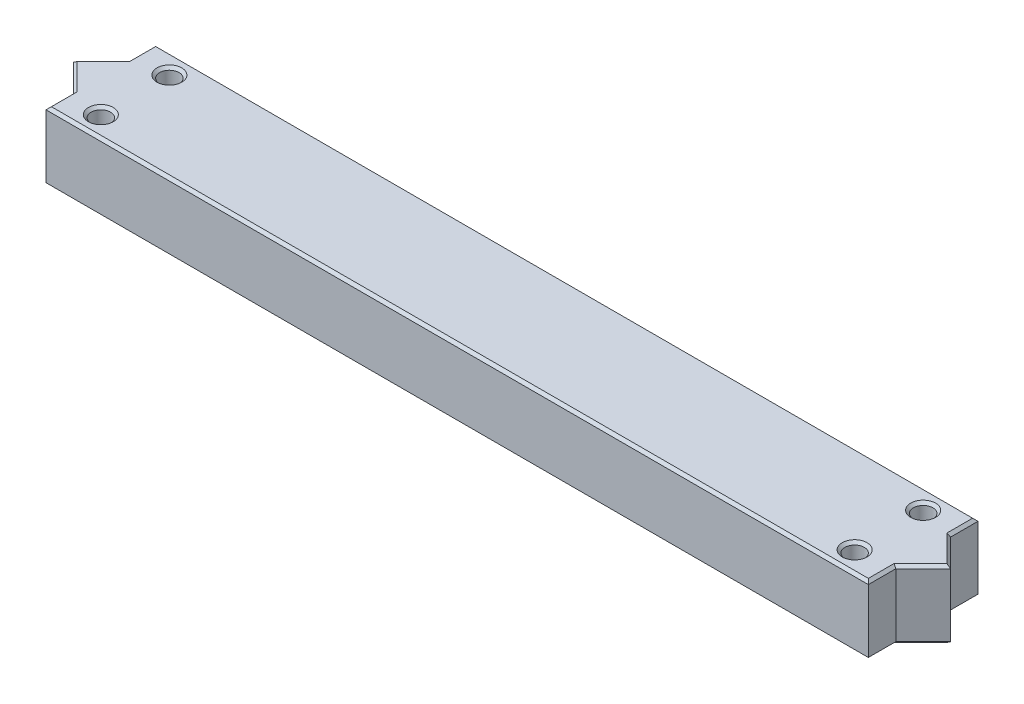
ISO-10303-21;
HEADER;
FILE_DESCRIPTION(('STEP AP214'),'2;1');
FILE_NAME('part.step','',(''),(''),'','','');
FILE_SCHEMA(('AUTOMOTIVE_DESIGN { 1 0 10303 214 1 1 1 1 }'));
ENDSEC;
DATA;
#1=APPLICATION_CONTEXT('core data for automotive mechanical design processes');
#2=APPLICATION_PROTOCOL_DEFINITION('international standard','automotive_design',2000,#1);
#3=PRODUCT_CONTEXT('',#1,'mechanical');
#4=PRODUCT('Part','Part','',(#3));
#5=PRODUCT_RELATED_PRODUCT_CATEGORY('part','',(#4));
#6=PRODUCT_DEFINITION_FORMATION('','',#4);
#7=PRODUCT_DEFINITION_CONTEXT('part definition',#1,'design');
#8=PRODUCT_DEFINITION('design','',#6,#7);
#9=PRODUCT_DEFINITION_SHAPE('','',#8);
#10=(LENGTH_UNIT() NAMED_UNIT(*) SI_UNIT(.MILLI.,.METRE.));
#11=(NAMED_UNIT(*) PLANE_ANGLE_UNIT() SI_UNIT($,.RADIAN.));
#12=(NAMED_UNIT(*) SI_UNIT($,.STERADIAN.) SOLID_ANGLE_UNIT());
#13=UNCERTAINTY_MEASURE_WITH_UNIT(LENGTH_MEASURE(1.E-05),#10,'distance_accuracy_value','');
#14=(GEOMETRIC_REPRESENTATION_CONTEXT(3) GLOBAL_UNCERTAINTY_ASSIGNED_CONTEXT((#13)) GLOBAL_UNIT_ASSIGNED_CONTEXT((#10,
#11,#12)) REPRESENTATION_CONTEXT('',''));
#15=CARTESIAN_POINT('',(0.,0.,0.));
#16=DIRECTION('',(0.,0.,1.));
#17=DIRECTION('',(1.,0.,0.));
#18=AXIS2_PLACEMENT_3D('',#15,#16,#17);
#19=CARTESIAN_POINT('',(0.,12.7,0.));
#20=DIRECTION('',(0.,1.,0.));
#21=DIRECTION('',(0.,0.,1.));
#22=AXIS2_PLACEMENT_3D('',#19,#20,#21);
#23=PLANE('',#22);
#24=CARTESIAN_POINT('',(69.85,12.7,-6.35));
#25=DIRECTION('',(0.,1.,0.));
#26=DIRECTION('',(0.,0.,1.));
#27=AXIS2_PLACEMENT_3D('',#24,#25,#26);
#28=CIRCLE('',#27,2.30000000000001);
#29=CARTESIAN_POINT('',(69.85,12.7,-4.04999999999999));
#30=VERTEX_POINT('',#29);
#31=EDGE_CURVE('E11',#30,#30,#28,.F.);
#32=ORIENTED_EDGE('',*,*,#31,.T.);
#33=EDGE_LOOP('',(#32));
#34=FACE_BOUND('',#33,.T.);
#35=CARTESIAN_POINT('',(-69.85,12.7,6.35));
#36=DIRECTION('',(0.,1.,0.));
#37=DIRECTION('',(0.,0.,1.));
#38=AXIS2_PLACEMENT_3D('',#35,#36,#37);
#39=CIRCLE('',#38,2.30000000000001);
#40=CARTESIAN_POINT('',(-69.85,12.7,8.65000000000001));
#41=VERTEX_POINT('',#40);
#42=EDGE_CURVE('E47',#41,#41,#39,.F.);
#43=ORIENTED_EDGE('',*,*,#42,.T.);
#44=EDGE_LOOP('',(#43));
#45=FACE_BOUND('',#44,.T.);
#46=DIRECTION('',(0.,0.,1.));
#47=VECTOR('',#46,1.);
#48=CARTESIAN_POINT('',(-75.7,12.7,10.16));
#49=LINE('',#48,#47);
#50=CARTESIAN_POINT('',(-75.7,12.7,4.87289321881346));
#51=VERTEX_POINT('',#50);
#52=CARTESIAN_POINT('',(-75.7,12.7,9.66000000000002));
#53=VERTEX_POINT('',#52);
#54=EDGE_CURVE('E55',#51,#53,#49,.T.);
#55=ORIENTED_EDGE('',*,*,#54,.T.);
#56=DIRECTION('',(1.,0.,0.));
#57=VECTOR('',#56,1.);
#58=CARTESIAN_POINT('',(76.2,12.7,9.66000000000002));
#59=LINE('',#58,#57);
#60=CARTESIAN_POINT('',(75.7,12.7,9.66000000000002));
#61=VERTEX_POINT('',#60);
#62=EDGE_CURVE('E307',#53,#61,#59,.T.);
#63=ORIENTED_EDGE('',*,*,#62,.T.);
#64=DIRECTION('',(0.,0.,-1.));
#65=VECTOR('',#64,1.);
#66=CARTESIAN_POINT('',(75.7,12.7,5.08));
#67=LINE('',#66,#65);
#68=CARTESIAN_POINT('',(75.7,12.7,4.87289321881347));
#69=VERTEX_POINT('',#68);
#70=EDGE_CURVE('E291',#61,#69,#67,.T.);
#71=ORIENTED_EDGE('',*,*,#70,.T.);
#72=DIRECTION('',(0.707106781186548,0.,-0.707106781186547));
#73=VECTOR('',#72,1.);
#74=CARTESIAN_POINT('',(80.9264466094068,12.7,-0.353553390593263));
#75=LINE('',#74,#73);
#76=CARTESIAN_POINT('',(80.5728932188135,12.7,0.));
#77=VERTEX_POINT('',#76);
#78=EDGE_CURVE('E293',#69,#77,#75,.T.);
#79=ORIENTED_EDGE('',*,*,#78,.T.);
#80=DIRECTION('',(-0.707106781186548,0.,-0.707106781186547));
#81=VECTOR('',#80,1.);
#82=CARTESIAN_POINT('',(75.8464466094067,12.7,-4.72644660940674));
#83=LINE('',#82,#81);
#84=CARTESIAN_POINT('',(75.7,12.7,-4.87289321881346));
#85=VERTEX_POINT('',#84);
#86=EDGE_CURVE('E295',#77,#85,#83,.T.);
#87=ORIENTED_EDGE('',*,*,#86,.T.);
#88=DIRECTION('',(0.,0.,-1.));
#89=VECTOR('',#88,1.);
#90=CARTESIAN_POINT('',(75.7,12.7,-10.16));
#91=LINE('',#90,#89);
#92=CARTESIAN_POINT('',(75.7,12.7,-9.66000000000001));
#93=VERTEX_POINT('',#92);
#94=EDGE_CURVE('E297',#85,#93,#91,.T.);
#95=ORIENTED_EDGE('',*,*,#94,.T.);
#96=DIRECTION('',(-1.,0.,0.));
#97=VECTOR('',#96,1.);
#98=CARTESIAN_POINT('',(-76.2,12.7,-9.66000000000001));
#99=LINE('',#98,#97);
#100=CARTESIAN_POINT('',(-75.7,12.7,-9.66000000000001));
#101=VERTEX_POINT('',#100);
#102=EDGE_CURVE('E299',#93,#101,#99,.T.);
#103=ORIENTED_EDGE('',*,*,#102,.T.);
#104=DIRECTION('',(0.,0.,1.));
#105=VECTOR('',#104,1.);
#106=CARTESIAN_POINT('',(-75.7,12.7,-5.08));
#107=LINE('',#106,#105);
#108=CARTESIAN_POINT('',(-75.7,12.7,-4.87289321881347));
#109=VERTEX_POINT('',#108);
#110=EDGE_CURVE('E301',#101,#109,#107,.T.);
#111=ORIENTED_EDGE('',*,*,#110,.T.);
#112=DIRECTION('',(-0.707106781186548,0.,0.707106781186547));
#113=VECTOR('',#112,1.);
#114=CARTESIAN_POINT('',(-80.9264466094068,12.7,0.353553390593263));
#115=LINE('',#114,#113);
#116=CARTESIAN_POINT('',(-80.5728932188135,12.7,0.));
#117=VERTEX_POINT('',#116);
#118=EDGE_CURVE('E303',#109,#117,#115,.T.);
#119=ORIENTED_EDGE('',*,*,#118,.T.);
#120=DIRECTION('',(0.707106781186548,0.,0.707106781186547));
#121=VECTOR('',#120,1.);
#122=CARTESIAN_POINT('',(-75.8464466094067,12.7,4.72644660940674));
#123=LINE('',#122,#121);
#124=EDGE_CURVE('E60',#117,#51,#123,.T.);
#125=ORIENTED_EDGE('',*,*,#124,.T.);
#126=EDGE_LOOP('',(#55,#63,#71,#79,#87,#95,#103,#111,#119,#125));
#127=FACE_BOUND('',#126,.T.);
#128=CARTESIAN_POINT('',(-69.85,12.7,-6.35));
#129=DIRECTION('',(0.,1.,0.));
#130=DIRECTION('',(0.,0.,1.));
#131=AXIS2_PLACEMENT_3D('',#128,#129,#130);
#132=CIRCLE('',#131,2.30000000000001);
#133=CARTESIAN_POINT('',(-69.85,12.7,-4.04999999999999));
#134=VERTEX_POINT('',#133);
#135=EDGE_CURVE('E288',#134,#134,#132,.F.);
#136=ORIENTED_EDGE('',*,*,#135,.T.);
#137=EDGE_LOOP('',(#136));
#138=FACE_BOUND('',#137,.T.);
#139=CARTESIAN_POINT('',(69.85,12.7,6.35));
#140=DIRECTION('',(0.,1.,0.));
#141=DIRECTION('',(0.,0.,1.));
#142=AXIS2_PLACEMENT_3D('',#139,#140,#141);
#143=CIRCLE('',#142,2.30000000000001);
#144=CARTESIAN_POINT('',(69.85,12.7,8.65000000000001));
#145=VERTEX_POINT('',#144);
#146=EDGE_CURVE('E285',#145,#145,#143,.F.);
#147=ORIENTED_EDGE('',*,*,#146,.T.);
#148=EDGE_LOOP('',(#147));
#149=FACE_BOUND('',#148,.T.);
#150=ADVANCED_FACE('F37',(#34,#45,#127,#138,#149),#23,.T.);
#151=CARTESIAN_POINT('',(0.,0.,0.));
#152=DIRECTION('',(0.,1.,0.));
#153=DIRECTION('',(0.,0.,1.));
#154=AXIS2_PLACEMENT_3D('',#151,#152,#153);
#155=PLANE('',#154);
#156=CARTESIAN_POINT('',(69.85,0.,-6.35));
#157=DIRECTION('',(0.,1.,0.));
#158=DIRECTION('',(0.,0.,1.));
#159=AXIS2_PLACEMENT_3D('',#156,#157,#158);
#160=CIRCLE('',#159,2.30000000000001);
#161=CARTESIAN_POINT('',(69.85,0.,-4.04999999999999));
#162=VERTEX_POINT('',#161);
#163=EDGE_CURVE('E218',#162,#162,#160,.T.);
#164=ORIENTED_EDGE('',*,*,#163,.T.);
#165=EDGE_LOOP('',(#164));
#166=FACE_BOUND('',#165,.T.);
#167=CARTESIAN_POINT('',(69.85,0.,6.35));
#168=DIRECTION('',(0.,1.,0.));
#169=DIRECTION('',(0.,0.,1.));
#170=AXIS2_PLACEMENT_3D('',#167,#168,#169);
#171=CIRCLE('',#170,2.30000000000001);
#172=CARTESIAN_POINT('',(69.85,0.,8.65000000000001));
#173=VERTEX_POINT('',#172);
#174=EDGE_CURVE('E215',#173,#173,#171,.T.);
#175=ORIENTED_EDGE('',*,*,#174,.T.);
#176=EDGE_LOOP('',(#175));
#177=FACE_BOUND('',#176,.T.);
#178=CARTESIAN_POINT('',(-69.85,0.,6.35));
#179=DIRECTION('',(0.,1.,0.));
#180=DIRECTION('',(0.,0.,1.));
#181=AXIS2_PLACEMENT_3D('',#178,#179,#180);
#182=CIRCLE('',#181,2.30000000000001);
#183=CARTESIAN_POINT('',(-69.85,0.,8.65000000000001));
#184=VERTEX_POINT('',#183);
#185=EDGE_CURVE('E207',#184,#184,#182,.T.);
#186=ORIENTED_EDGE('',*,*,#185,.T.);
#187=EDGE_LOOP('',(#186));
#188=FACE_BOUND('',#187,.T.);
#189=CARTESIAN_POINT('',(-69.85,0.,-6.35));
#190=DIRECTION('',(0.,1.,0.));
#191=DIRECTION('',(0.,0.,1.));
#192=AXIS2_PLACEMENT_3D('',#189,#190,#191);
#193=CIRCLE('',#192,2.30000000000001);
#194=CARTESIAN_POINT('',(-69.85,0.,-4.04999999999999));
#195=VERTEX_POINT('',#194);
#196=EDGE_CURVE('E204',#195,#195,#193,.T.);
#197=ORIENTED_EDGE('',*,*,#196,.T.);
#198=EDGE_LOOP('',(#197));
#199=FACE_BOUND('',#198,.T.);
#200=DIRECTION('',(0.707106781186548,0.,0.707106781186547));
#201=VECTOR('',#200,1.);
#202=CARTESIAN_POINT('',(40.2864466094067,0.,-40.2864466094067));
#203=LINE('',#202,#201);
#204=CARTESIAN_POINT('',(75.7,0.,-4.87289321881346));
#205=VERTEX_POINT('',#204);
#206=CARTESIAN_POINT('',(80.5728932188135,0.,0.));
#207=VERTEX_POINT('',#206);
#208=EDGE_CURVE('E203',#205,#207,#203,.T.);
#209=ORIENTED_EDGE('',*,*,#208,.T.);
#210=DIRECTION('',(-0.707106781186548,0.,0.707106781186547));
#211=VECTOR('',#210,1.);
#212=CARTESIAN_POINT('',(40.2864466094067,0.,40.2864466094067));
#213=LINE('',#212,#211);
#214=CARTESIAN_POINT('',(75.7,0.,4.87289321881346));
#215=VERTEX_POINT('',#214);
#216=EDGE_CURVE('E182',#207,#215,#213,.T.);
#217=ORIENTED_EDGE('',*,*,#216,.T.);
#218=DIRECTION('',(0.,0.,1.));
#219=VECTOR('',#218,1.);
#220=CARTESIAN_POINT('',(75.7,0.,0.));
#221=LINE('',#220,#219);
#222=CARTESIAN_POINT('',(75.7,0.,9.66000000000002));
#223=VERTEX_POINT('',#222);
#224=EDGE_CURVE('E192',#215,#223,#221,.T.);
#225=ORIENTED_EDGE('',*,*,#224,.T.);
#226=DIRECTION('',(-1.,0.,0.));
#227=VECTOR('',#226,1.);
#228=CARTESIAN_POINT('',(0.,0.,9.66000000000002));
#229=LINE('',#228,#227);
#230=CARTESIAN_POINT('',(-75.7,0.,9.66000000000002));
#231=VERTEX_POINT('',#230);
#232=EDGE_CURVE('E198',#223,#231,#229,.T.);
#233=ORIENTED_EDGE('',*,*,#232,.T.);
#234=DIRECTION('',(0.,0.,-1.));
#235=VECTOR('',#234,1.);
#236=CARTESIAN_POINT('',(-75.7,0.,0.));
#237=LINE('',#236,#235);
#238=CARTESIAN_POINT('',(-75.7,0.,4.87289321881346));
#239=VERTEX_POINT('',#238);
#240=EDGE_CURVE('E399',#231,#239,#237,.T.);
#241=ORIENTED_EDGE('',*,*,#240,.T.);
#242=DIRECTION('',(-0.707106781186548,0.,-0.707106781186547));
#243=VECTOR('',#242,1.);
#244=CARTESIAN_POINT('',(-40.2864466094067,0.,40.2864466094067));
#245=LINE('',#244,#243);
#246=CARTESIAN_POINT('',(-80.5728932188135,0.,0.));
#247=VERTEX_POINT('',#246);
#248=EDGE_CURVE('E401',#239,#247,#245,.T.);
#249=ORIENTED_EDGE('',*,*,#248,.T.);
#250=DIRECTION('',(0.707106781186548,0.,-0.707106781186547));
#251=VECTOR('',#250,1.);
#252=CARTESIAN_POINT('',(-40.2864466094067,0.,-40.2864466094067));
#253=LINE('',#252,#251);
#254=CARTESIAN_POINT('',(-75.7,0.,-4.87289321881346));
#255=VERTEX_POINT('',#254);
#256=EDGE_CURVE('E403',#247,#255,#253,.T.);
#257=ORIENTED_EDGE('',*,*,#256,.T.);
#258=DIRECTION('',(0.,0.,-1.));
#259=VECTOR('',#258,1.);
#260=CARTESIAN_POINT('',(-75.7,0.,0.));
#261=LINE('',#260,#259);
#262=CARTESIAN_POINT('',(-75.7,0.,-9.66000000000001));
#263=VERTEX_POINT('',#262);
#264=EDGE_CURVE('E405',#255,#263,#261,.T.);
#265=ORIENTED_EDGE('',*,*,#264,.T.);
#266=DIRECTION('',(1.,0.,0.));
#267=VECTOR('',#266,1.);
#268=CARTESIAN_POINT('',(0.,0.,-9.66000000000001));
#269=LINE('',#268,#267);
#270=CARTESIAN_POINT('',(75.7,0.,-9.66000000000001));
#271=VERTEX_POINT('',#270);
#272=EDGE_CURVE('E407',#263,#271,#269,.T.);
#273=ORIENTED_EDGE('',*,*,#272,.T.);
#274=DIRECTION('',(0.,0.,1.));
#275=VECTOR('',#274,1.);
#276=CARTESIAN_POINT('',(75.7,0.,0.));
#277=LINE('',#276,#275);
#278=EDGE_CURVE('E209',#271,#205,#277,.T.);
#279=ORIENTED_EDGE('',*,*,#278,.T.);
#280=EDGE_LOOP('',(#209,#217,#225,#233,#241,#249,#257,#265,#273,#279));
#281=FACE_BOUND('',#280,.T.);
#282=ADVANCED_FACE('F201',(#166,#177,#188,#199,#281),#155,.F.);
#283=CARTESIAN_POINT('',(76.2,12.7,5.08));
#284=DIRECTION('',(-1.,0.,0.));
#285=DIRECTION('',(0.,0.,1.));
#286=AXIS2_PLACEMENT_3D('',#283,#284,#285);
#287=PLANE('',#286);
#288=DIRECTION('',(0.,-1.,0.));
#289=VECTOR('',#288,1.);
#290=CARTESIAN_POINT('',(76.2,12.7,10.16));
#291=LINE('',#290,#289);
#292=CARTESIAN_POINT('',(76.2,12.2,10.16));
#293=VERTEX_POINT('',#292);
#294=CARTESIAN_POINT('',(76.2,0.499999999999987,10.16));
#295=VERTEX_POINT('',#294);
#296=EDGE_CURVE('E333',#293,#295,#291,.T.);
#297=ORIENTED_EDGE('',*,*,#296,.T.);
#298=DIRECTION('',(0.,0.,-1.));
#299=VECTOR('',#298,1.);
#300=CARTESIAN_POINT('',(76.2,0.499999999999987,5.08));
#301=LINE('',#300,#299);
#302=CARTESIAN_POINT('',(76.2,0.499999999999987,5.08));
#303=VERTEX_POINT('',#302);
#304=EDGE_CURVE('E283',#295,#303,#301,.T.);
#305=ORIENTED_EDGE('',*,*,#304,.T.);
#306=DIRECTION('',(0.,-1.,0.));
#307=VECTOR('',#306,1.);
#308=CARTESIAN_POINT('',(76.2,12.7,5.08));
#309=LINE('',#308,#307);
#310=CARTESIAN_POINT('',(76.2,12.2,5.08));
#311=VERTEX_POINT('',#310);
#312=EDGE_CURVE('E199',#311,#303,#309,.T.);
#313=ORIENTED_EDGE('',*,*,#312,.F.);
#314=DIRECTION('',(0.,0.,1.));
#315=VECTOR('',#314,1.);
#316=CARTESIAN_POINT('',(76.2,12.2,10.16));
#317=LINE('',#316,#315);
#318=EDGE_CURVE('E281',#311,#293,#317,.T.);
#319=ORIENTED_EDGE('',*,*,#318,.T.);
#320=EDGE_LOOP('',(#297,#305,#313,#319));
#321=FACE_BOUND('',#320,.T.);
#322=ADVANCED_FACE('F437',(#321),#287,.F.);
#323=CARTESIAN_POINT('',(81.28,12.7,0.));
#324=DIRECTION('',(-0.707106781186547,0.,-0.707106781186548));
#325=DIRECTION('',(-0.707106781186548,0.,0.707106781186547));
#326=AXIS2_PLACEMENT_3D('',#323,#324,#325);
#327=PLANE('',#326);
#328=ORIENTED_EDGE('',*,*,#312,.T.);
#329=DIRECTION('',(0.707106781186548,0.,-0.707106781186547));
#330=VECTOR('',#329,1.);
#331=CARTESIAN_POINT('',(81.28,0.499999999999987,0.));
#332=LINE('',#331,#330);
#333=CARTESIAN_POINT('',(81.28,0.499999999999987,0.));
#334=VERTEX_POINT('',#333);
#335=EDGE_CURVE('E185',#303,#334,#332,.T.);
#336=ORIENTED_EDGE('',*,*,#335,.T.);
#337=DIRECTION('',(0.,-1.,0.));
#338=VECTOR('',#337,1.);
#339=CARTESIAN_POINT('',(81.28,12.7,0.));
#340=LINE('',#339,#338);
#341=CARTESIAN_POINT('',(81.28,12.2,0.));
#342=VERTEX_POINT('',#341);
#343=EDGE_CURVE('E388',#342,#334,#340,.T.);
#344=ORIENTED_EDGE('',*,*,#343,.F.);
#345=DIRECTION('',(-0.707106781186548,0.,0.707106781186547));
#346=VECTOR('',#345,1.);
#347=CARTESIAN_POINT('',(76.2,12.2,5.08));
#348=LINE('',#347,#346);
#349=EDGE_CURVE('E245',#342,#311,#348,.T.);
#350=ORIENTED_EDGE('',*,*,#349,.T.);
#351=EDGE_LOOP('',(#328,#336,#344,#350));
#352=FACE_BOUND('',#351,.T.);
#353=ADVANCED_FACE('F420',(#352),#327,.F.);
#354=CARTESIAN_POINT('',(76.2,12.7,-5.08));
#355=DIRECTION('',(-0.707106781186547,0.,0.707106781186548));
#356=DIRECTION('',(0.707106781186548,0.,0.707106781186547));
#357=AXIS2_PLACEMENT_3D('',#354,#355,#356);
#358=PLANE('',#357);
#359=ORIENTED_EDGE('',*,*,#343,.T.);
#360=DIRECTION('',(-0.707106781186548,0.,-0.707106781186547));
#361=VECTOR('',#360,1.);
#362=CARTESIAN_POINT('',(76.2,0.499999999999987,-5.08));
#363=LINE('',#362,#361);
#364=CARTESIAN_POINT('',(76.2,0.499999999999987,-5.08));
#365=VERTEX_POINT('',#364);
#366=EDGE_CURVE('E250',#334,#365,#363,.T.);
#367=ORIENTED_EDGE('',*,*,#366,.T.);
#368=DIRECTION('',(0.,-1.,0.));
#369=VECTOR('',#368,1.);
#370=CARTESIAN_POINT('',(76.2,12.7,-5.08));
#371=LINE('',#370,#369);
#372=CARTESIAN_POINT('',(76.2,12.2,-5.08));
#373=VERTEX_POINT('',#372);
#374=EDGE_CURVE('E386',#373,#365,#371,.T.);
#375=ORIENTED_EDGE('',*,*,#374,.F.);
#376=DIRECTION('',(0.707106781186548,0.,0.707106781186547));
#377=VECTOR('',#376,1.);
#378=CARTESIAN_POINT('',(81.28,12.2,0.));
#379=LINE('',#378,#377);
#380=EDGE_CURVE('E248',#373,#342,#379,.T.);
#381=ORIENTED_EDGE('',*,*,#380,.T.);
#382=EDGE_LOOP('',(#359,#367,#375,#381));
#383=FACE_BOUND('',#382,.T.);
#384=ADVANCED_FACE('F423',(#383),#358,.F.);
#385=CARTESIAN_POINT('',(76.2,12.7,-10.16));
#386=DIRECTION('',(-1.,0.,0.));
#387=DIRECTION('',(0.,0.,1.));
#388=AXIS2_PLACEMENT_3D('',#385,#386,#387);
#389=PLANE('',#388);
#390=ORIENTED_EDGE('',*,*,#374,.T.);
#391=DIRECTION('',(0.,0.,-1.));
#392=VECTOR('',#391,1.);
#393=CARTESIAN_POINT('',(76.2,0.499999999999987,-10.16));
#394=LINE('',#393,#392);
#395=CARTESIAN_POINT('',(76.2,0.499999999999987,-10.16));
#396=VERTEX_POINT('',#395);
#397=EDGE_CURVE('E254',#365,#396,#394,.T.);
#398=ORIENTED_EDGE('',*,*,#397,.T.);
#399=DIRECTION('',(0.,-1.,0.));
#400=VECTOR('',#399,1.);
#401=CARTESIAN_POINT('',(76.2,12.7,-10.16));
#402=LINE('',#401,#400);
#403=CARTESIAN_POINT('',(76.2,12.2,-10.16));
#404=VERTEX_POINT('',#403);
#405=EDGE_CURVE('E377',#404,#396,#402,.T.);
#406=ORIENTED_EDGE('',*,*,#405,.F.);
#407=DIRECTION('',(0.,0.,1.));
#408=VECTOR('',#407,1.);
#409=CARTESIAN_POINT('',(76.2,12.2,-5.08));
#410=LINE('',#409,#408);
#411=EDGE_CURVE('E252',#404,#373,#410,.T.);
#412=ORIENTED_EDGE('',*,*,#411,.T.);
#413=EDGE_LOOP('',(#390,#398,#406,#412));
#414=FACE_BOUND('',#413,.T.);
#415=ADVANCED_FACE('F383',(#414),#389,.F.);
#416=CARTESIAN_POINT('',(-76.2,12.7,-10.16));
#417=DIRECTION('',(0.,0.,1.));
#418=DIRECTION('',(1.,0.,0.));
#419=AXIS2_PLACEMENT_3D('',#416,#417,#418);
#420=PLANE('',#419);
#421=ORIENTED_EDGE('',*,*,#405,.T.);
#422=DIRECTION('',(-1.,0.,0.));
#423=VECTOR('',#422,1.);
#424=CARTESIAN_POINT('',(-76.2,0.499999999999987,-10.16));
#425=LINE('',#424,#423);
#426=CARTESIAN_POINT('',(-76.2,0.499999999999987,-10.16));
#427=VERTEX_POINT('',#426);
#428=EDGE_CURVE('E258',#396,#427,#425,.T.);
#429=ORIENTED_EDGE('',*,*,#428,.T.);
#430=DIRECTION('',(0.,-1.,0.));
#431=VECTOR('',#430,1.);
#432=CARTESIAN_POINT('',(-76.2,12.7,-10.16));
#433=LINE('',#432,#431);
#434=CARTESIAN_POINT('',(-76.2,12.2,-10.16));
#435=VERTEX_POINT('',#434);
#436=EDGE_CURVE('E380',#435,#427,#433,.T.);
#437=ORIENTED_EDGE('',*,*,#436,.F.);
#438=DIRECTION('',(1.,0.,0.));
#439=VECTOR('',#438,1.);
#440=CARTESIAN_POINT('',(76.2,12.2,-10.16));
#441=LINE('',#440,#439);
#442=EDGE_CURVE('E256',#435,#404,#441,.T.);
#443=ORIENTED_EDGE('',*,*,#442,.T.);
#444=EDGE_LOOP('',(#421,#429,#437,#443));
#445=FACE_BOUND('',#444,.T.);
#446=ADVANCED_FACE('F376',(#445),#420,.F.);
#447=CARTESIAN_POINT('',(-76.2,12.7,-10.16));
#448=DIRECTION('',(1.,0.,0.));
#449=DIRECTION('',(0.,0.,-1.));
#450=AXIS2_PLACEMENT_3D('',#447,#448,#449);
#451=PLANE('',#450);
#452=ORIENTED_EDGE('',*,*,#436,.T.);
#453=DIRECTION('',(0.,0.,1.));
#454=VECTOR('',#453,1.);
#455=CARTESIAN_POINT('',(-76.2,0.499999999999987,-10.16));
#456=LINE('',#455,#454);
#457=CARTESIAN_POINT('',(-76.2,0.499999999999987,-5.08));
#458=VERTEX_POINT('',#457);
#459=EDGE_CURVE('E262',#427,#458,#456,.T.);
#460=ORIENTED_EDGE('',*,*,#459,.T.);
#461=DIRECTION('',(0.,-1.,0.));
#462=VECTOR('',#461,1.);
#463=CARTESIAN_POINT('',(-76.2,12.7,-5.08));
#464=LINE('',#463,#462);
#465=CARTESIAN_POINT('',(-76.2,12.2,-5.08));
#466=VERTEX_POINT('',#465);
#467=EDGE_CURVE('E390',#466,#458,#464,.T.);
#468=ORIENTED_EDGE('',*,*,#467,.F.);
#469=DIRECTION('',(0.,0.,-1.));
#470=VECTOR('',#469,1.);
#471=CARTESIAN_POINT('',(-76.2,12.2,-10.16));
#472=LINE('',#471,#470);
#473=EDGE_CURVE('E260',#466,#435,#472,.T.);
#474=ORIENTED_EDGE('',*,*,#473,.T.);
#475=EDGE_LOOP('',(#452,#460,#468,#474));
#476=FACE_BOUND('',#475,.T.);
#477=ADVANCED_FACE('F470',(#476),#451,.F.);
#478=CARTESIAN_POINT('',(-76.2,12.7,-5.08));
#479=DIRECTION('',(0.707106781186547,0.,0.707106781186548));
#480=DIRECTION('',(0.707106781186548,0.,-0.707106781186547));
#481=AXIS2_PLACEMENT_3D('',#478,#479,#480);
#482=PLANE('',#481);
#483=ORIENTED_EDGE('',*,*,#467,.T.);
#484=DIRECTION('',(-0.707106781186548,0.,0.707106781186547));
#485=VECTOR('',#484,1.);
#486=CARTESIAN_POINT('',(-76.2,0.499999999999987,-5.08));
#487=LINE('',#486,#485);
#488=CARTESIAN_POINT('',(-81.28,0.499999999999987,0.));
#489=VERTEX_POINT('',#488);
#490=EDGE_CURVE('E266',#458,#489,#487,.T.);
#491=ORIENTED_EDGE('',*,*,#490,.T.);
#492=DIRECTION('',(0.,-1.,0.));
#493=VECTOR('',#492,1.);
#494=CARTESIAN_POINT('',(-81.28,12.7,0.));
#495=LINE('',#494,#493);
#496=CARTESIAN_POINT('',(-81.28,12.2,0.));
#497=VERTEX_POINT('',#496);
#498=EDGE_CURVE('E474',#497,#489,#495,.T.);
#499=ORIENTED_EDGE('',*,*,#498,.F.);
#500=DIRECTION('',(0.707106781186548,0.,-0.707106781186547));
#501=VECTOR('',#500,1.);
#502=CARTESIAN_POINT('',(-76.2,12.2,-5.08));
#503=LINE('',#502,#501);
#504=EDGE_CURVE('E264',#497,#466,#503,.T.);
#505=ORIENTED_EDGE('',*,*,#504,.T.);
#506=EDGE_LOOP('',(#483,#491,#499,#505));
#507=FACE_BOUND('',#506,.T.);
#508=ADVANCED_FACE('F534',(#507),#482,.F.);
#509=CARTESIAN_POINT('',(-81.28,12.7,0.));
#510=DIRECTION('',(0.707106781186547,0.,-0.707106781186548));
#511=DIRECTION('',(-0.707106781186548,0.,-0.707106781186547));
#512=AXIS2_PLACEMENT_3D('',#509,#510,#511);
#513=PLANE('',#512);
#514=ORIENTED_EDGE('',*,*,#498,.T.);
#515=DIRECTION('',(0.707106781186548,0.,0.707106781186547));
#516=VECTOR('',#515,1.);
#517=CARTESIAN_POINT('',(-81.28,0.499999999999987,0.));
#518=LINE('',#517,#516);
#519=CARTESIAN_POINT('',(-76.2,0.499999999999987,5.08));
#520=VERTEX_POINT('',#519);
#521=EDGE_CURVE('E270',#489,#520,#518,.T.);
#522=ORIENTED_EDGE('',*,*,#521,.T.);
#523=DIRECTION('',(0.,-1.,0.));
#524=VECTOR('',#523,1.);
#525=CARTESIAN_POINT('',(-76.2,12.7,5.08));
#526=LINE('',#525,#524);
#527=CARTESIAN_POINT('',(-76.2,12.2,5.08));
#528=VERTEX_POINT('',#527);
#529=EDGE_CURVE('E476',#528,#520,#526,.T.);
#530=ORIENTED_EDGE('',*,*,#529,.F.);
#531=DIRECTION('',(-0.707106781186548,0.,-0.707106781186547));
#532=VECTOR('',#531,1.);
#533=CARTESIAN_POINT('',(-81.28,12.2,0.));
#534=LINE('',#533,#532);
#535=EDGE_CURVE('E268',#528,#497,#534,.T.);
#536=ORIENTED_EDGE('',*,*,#535,.T.);
#537=EDGE_LOOP('',(#514,#522,#530,#536));
#538=FACE_BOUND('',#537,.T.);
#539=ADVANCED_FACE('F490',(#538),#513,.F.);
#540=CARTESIAN_POINT('',(-76.2,12.7,5.08));
#541=DIRECTION('',(1.,0.,0.));
#542=DIRECTION('',(0.,0.,-1.));
#543=AXIS2_PLACEMENT_3D('',#540,#541,#542);
#544=PLANE('',#543);
#545=ORIENTED_EDGE('',*,*,#529,.T.);
#546=DIRECTION('',(0.,0.,1.));
#547=VECTOR('',#546,1.);
#548=CARTESIAN_POINT('',(-76.2,0.499999999999987,5.08));
#549=LINE('',#548,#547);
#550=CARTESIAN_POINT('',(-76.2,0.499999999999987,10.16));
#551=VERTEX_POINT('',#550);
#552=EDGE_CURVE('E274',#520,#551,#549,.T.);
#553=ORIENTED_EDGE('',*,*,#552,.T.);
#554=DIRECTION('',(0.,-1.,0.));
#555=VECTOR('',#554,1.);
#556=CARTESIAN_POINT('',(-76.2,12.7,10.16));
#557=LINE('',#556,#555);
#558=CARTESIAN_POINT('',(-76.2,12.2,10.16));
#559=VERTEX_POINT('',#558);
#560=EDGE_CURVE('E441',#559,#551,#557,.T.);
#561=ORIENTED_EDGE('',*,*,#560,.F.);
#562=DIRECTION('',(0.,0.,-1.));
#563=VECTOR('',#562,1.);
#564=CARTESIAN_POINT('',(-76.2,12.2,5.08));
#565=LINE('',#564,#563);
#566=EDGE_CURVE('E272',#559,#528,#565,.T.);
#567=ORIENTED_EDGE('',*,*,#566,.T.);
#568=EDGE_LOOP('',(#545,#553,#561,#567));
#569=FACE_BOUND('',#568,.T.);
#570=ADVANCED_FACE('F485',(#569),#544,.F.);
#571=CARTESIAN_POINT('',(-76.2,12.7,10.16));
#572=DIRECTION('',(0.,0.,-1.));
#573=DIRECTION('',(-1.,0.,0.));
#574=AXIS2_PLACEMENT_3D('',#571,#572,#573);
#575=PLANE('',#574);
#576=ORIENTED_EDGE('',*,*,#560,.T.);
#577=DIRECTION('',(1.,0.,0.));
#578=VECTOR('',#577,1.);
#579=CARTESIAN_POINT('',(-76.2,0.499999999999987,10.16));
#580=LINE('',#579,#578);
#581=EDGE_CURVE('E279',#551,#295,#580,.T.);
#582=ORIENTED_EDGE('',*,*,#581,.T.);
#583=ORIENTED_EDGE('',*,*,#296,.F.);
#584=DIRECTION('',(-1.,0.,0.));
#585=VECTOR('',#584,1.);
#586=CARTESIAN_POINT('',(-76.2,12.2,10.16));
#587=LINE('',#586,#585);
#588=EDGE_CURVE('E276',#293,#559,#587,.T.);
#589=ORIENTED_EDGE('',*,*,#588,.T.);
#590=EDGE_LOOP('',(#576,#582,#583,#589));
#591=FACE_BOUND('',#590,.T.);
#592=ADVANCED_FACE('F483',(#591),#575,.F.);
#593=CARTESIAN_POINT('',(-69.85,12.7,-6.35));
#594=DIRECTION('',(0.,-1.,0.));
#595=DIRECTION('',(0.,0.,-1.));
#596=AXIS2_PLACEMENT_3D('',#593,#594,#595);
#597=CYLINDRICAL_SURFACE('',#596,1.79999999999999);
#598=CARTESIAN_POINT('',(-69.85,0.500000000000011,-6.35));
#599=DIRECTION('',(0.,1.,0.));
#600=DIRECTION('',(0.,0.,1.));
#601=AXIS2_PLACEMENT_3D('',#598,#599,#600);
#602=CIRCLE('',#601,1.79999999999999);
#603=CARTESIAN_POINT('',(-69.85,0.500000000000011,-4.55000000000001));
#604=VERTEX_POINT('',#603);
#605=EDGE_CURVE('E242',#604,#604,#602,.F.);
#606=ORIENTED_EDGE('',*,*,#605,.T.);
#607=EDGE_LOOP('',(#606));
#608=FACE_BOUND('',#607,.T.);
#609=CARTESIAN_POINT('',(-69.85,12.2,-6.35));
#610=DIRECTION('',(0.,1.,0.));
#611=DIRECTION('',(0.,0.,1.));
#612=AXIS2_PLACEMENT_3D('',#609,#610,#611);
#613=CIRCLE('',#612,1.79999999999999);
#614=CARTESIAN_POINT('',(-69.85,12.2,-4.55000000000001));
#615=VERTEX_POINT('',#614);
#616=EDGE_CURVE('E239',#615,#615,#613,.T.);
#617=ORIENTED_EDGE('',*,*,#616,.T.);
#618=EDGE_LOOP('',(#617));
#619=FACE_BOUND('',#618,.T.);
#620=ADVANCED_FACE('F525',(#608,#619),#597,.F.);
#621=CARTESIAN_POINT('',(-69.85,12.7,6.35));
#622=DIRECTION('',(0.,-1.,0.));
#623=DIRECTION('',(0.,0.,-1.));
#624=AXIS2_PLACEMENT_3D('',#621,#622,#623);
#625=CYLINDRICAL_SURFACE('',#624,1.79999999999999);
#626=CARTESIAN_POINT('',(-69.85,0.500000000000011,6.35));
#627=DIRECTION('',(0.,1.,0.));
#628=DIRECTION('',(0.,0.,1.));
#629=AXIS2_PLACEMENT_3D('',#626,#627,#628);
#630=CIRCLE('',#629,1.79999999999999);
#631=CARTESIAN_POINT('',(-69.85,0.500000000000011,8.14999999999999));
#632=VERTEX_POINT('',#631);
#633=EDGE_CURVE('E236',#632,#632,#630,.F.);
#634=ORIENTED_EDGE('',*,*,#633,.T.);
#635=EDGE_LOOP('',(#634));
#636=FACE_BOUND('',#635,.T.);
#637=CARTESIAN_POINT('',(-69.85,12.2,6.35));
#638=DIRECTION('',(0.,1.,0.));
#639=DIRECTION('',(0.,0.,1.));
#640=AXIS2_PLACEMENT_3D('',#637,#638,#639);
#641=CIRCLE('',#640,1.79999999999999);
#642=CARTESIAN_POINT('',(-69.85,12.2,8.14999999999999));
#643=VERTEX_POINT('',#642);
#644=EDGE_CURVE('E233',#643,#643,#641,.T.);
#645=ORIENTED_EDGE('',*,*,#644,.T.);
#646=EDGE_LOOP('',(#645));
#647=FACE_BOUND('',#646,.T.);
#648=ADVANCED_FACE('F736',(#636,#647),#625,.F.);
#649=CARTESIAN_POINT('',(69.85,12.7,6.35));
#650=DIRECTION('',(0.,-1.,0.));
#651=DIRECTION('',(0.,0.,-1.));
#652=AXIS2_PLACEMENT_3D('',#649,#650,#651);
#653=CYLINDRICAL_SURFACE('',#652,1.79999999999999);
#654=CARTESIAN_POINT('',(69.85,0.500000000000011,6.35));
#655=DIRECTION('',(0.,1.,0.));
#656=DIRECTION('',(0.,0.,1.));
#657=AXIS2_PLACEMENT_3D('',#654,#655,#656);
#658=CIRCLE('',#657,1.79999999999999);
#659=CARTESIAN_POINT('',(69.85,0.500000000000011,8.14999999999999));
#660=VERTEX_POINT('',#659);
#661=EDGE_CURVE('E230',#660,#660,#658,.F.);
#662=ORIENTED_EDGE('',*,*,#661,.T.);
#663=EDGE_LOOP('',(#662));
#664=FACE_BOUND('',#663,.T.);
#665=CARTESIAN_POINT('',(69.85,12.2,6.35));
#666=DIRECTION('',(0.,1.,0.));
#667=DIRECTION('',(0.,0.,1.));
#668=AXIS2_PLACEMENT_3D('',#665,#666,#667);
#669=CIRCLE('',#668,1.79999999999999);
#670=CARTESIAN_POINT('',(69.85,12.2,8.14999999999999));
#671=VERTEX_POINT('',#670);
#672=EDGE_CURVE('E227',#671,#671,#669,.T.);
#673=ORIENTED_EDGE('',*,*,#672,.T.);
#674=EDGE_LOOP('',(#673));
#675=FACE_BOUND('',#674,.T.);
#676=ADVANCED_FACE('F734',(#664,#675),#653,.F.);
#677=CARTESIAN_POINT('',(69.85,12.7,-6.35));
#678=DIRECTION('',(0.,-1.,0.));
#679=DIRECTION('',(0.,0.,-1.));
#680=AXIS2_PLACEMENT_3D('',#677,#678,#679);
#681=CYLINDRICAL_SURFACE('',#680,1.79999999999999);
#682=CARTESIAN_POINT('',(69.85,0.500000000000011,-6.35));
#683=DIRECTION('',(0.,1.,0.));
#684=DIRECTION('',(0.,0.,1.));
#685=AXIS2_PLACEMENT_3D('',#682,#683,#684);
#686=CIRCLE('',#685,1.79999999999999);
#687=CARTESIAN_POINT('',(69.85,0.500000000000011,-4.55000000000001));
#688=VERTEX_POINT('',#687);
#689=EDGE_CURVE('E224',#688,#688,#686,.F.);
#690=ORIENTED_EDGE('',*,*,#689,.T.);
#691=EDGE_LOOP('',(#690));
#692=FACE_BOUND('',#691,.T.);
#693=CARTESIAN_POINT('',(69.85,12.2,-6.35));
#694=DIRECTION('',(0.,1.,0.));
#695=DIRECTION('',(0.,0.,1.));
#696=AXIS2_PLACEMENT_3D('',#693,#694,#695);
#697=CIRCLE('',#696,1.79999999999999);
#698=CARTESIAN_POINT('',(69.85,12.2,-4.55000000000001));
#699=VERTEX_POINT('',#698);
#700=EDGE_CURVE('E221',#699,#699,#697,.T.);
#701=ORIENTED_EDGE('',*,*,#700,.T.);
#702=EDGE_LOOP('',(#701));
#703=FACE_BOUND('',#702,.T.);
#704=ADVANCED_FACE('F557',(#692,#703),#681,.F.);
#705=CARTESIAN_POINT('',(69.85,0.,-6.35));
#706=DIRECTION('',(0.,-1.,0.));
#707=DIRECTION('',(0.,0.,-1.));
#708=AXIS2_PLACEMENT_3D('',#705,#706,#707);
#709=CONICAL_SURFACE('',#708,2.30000000000001,0.785398163397454);
#710=ORIENTED_EDGE('',*,*,#689,.F.);
#711=EDGE_LOOP('',(#710));
#712=FACE_BOUND('',#711,.T.);
#713=ORIENTED_EDGE('',*,*,#163,.F.);
#714=EDGE_LOOP('',(#713));
#715=FACE_BOUND('',#714,.T.);
#716=ADVANCED_FACE('F550',(#712,#715),#709,.F.);
#717=CARTESIAN_POINT('',(69.85,0.,6.35));
#718=DIRECTION('',(0.,-1.,0.));
#719=DIRECTION('',(0.,0.,-1.));
#720=AXIS2_PLACEMENT_3D('',#717,#718,#719);
#721=CONICAL_SURFACE('',#720,2.30000000000001,0.785398163397454);
#722=ORIENTED_EDGE('',*,*,#661,.F.);
#723=EDGE_LOOP('',(#722));
#724=FACE_BOUND('',#723,.T.);
#725=ORIENTED_EDGE('',*,*,#174,.F.);
#726=EDGE_LOOP('',(#725));
#727=FACE_BOUND('',#726,.T.);
#728=ADVANCED_FACE('F556',(#724,#727),#721,.F.);
#729=CARTESIAN_POINT('',(-69.85,0.,6.35));
#730=DIRECTION('',(0.,-1.,0.));
#731=DIRECTION('',(0.,0.,-1.));
#732=AXIS2_PLACEMENT_3D('',#729,#730,#731);
#733=CONICAL_SURFACE('',#732,2.30000000000001,0.785398163397452);
#734=ORIENTED_EDGE('',*,*,#633,.F.);
#735=EDGE_LOOP('',(#734));
#736=FACE_BOUND('',#735,.T.);
#737=ORIENTED_EDGE('',*,*,#185,.F.);
#738=EDGE_LOOP('',(#737));
#739=FACE_BOUND('',#738,.T.);
#740=ADVANCED_FACE('F564',(#736,#739),#733,.F.);
#741=CARTESIAN_POINT('',(-69.85,0.,-6.35));
#742=DIRECTION('',(0.,-1.,0.));
#743=DIRECTION('',(0.,0.,-1.));
#744=AXIS2_PLACEMENT_3D('',#741,#742,#743);
#745=CONICAL_SURFACE('',#744,2.30000000000001,0.785398163397452);
#746=ORIENTED_EDGE('',*,*,#605,.F.);
#747=EDGE_LOOP('',(#746));
#748=FACE_BOUND('',#747,.T.);
#749=ORIENTED_EDGE('',*,*,#196,.F.);
#750=EDGE_LOOP('',(#749));
#751=FACE_BOUND('',#750,.T.);
#752=ADVANCED_FACE('F571',(#748,#751),#745,.F.);
#753=CARTESIAN_POINT('',(-76.2,0.499999999999987,-5.08));
#754=DIRECTION('',(0.500000000000002,0.707106781186545,0.500000000000002));
#755=DIRECTION('',(-0.707106781186548,0.,0.707106781186547));
#756=AXIS2_PLACEMENT_3D('',#753,#754,#755);
#757=PLANE('',#756);
#758=DIRECTION('',(0.678598344545848,-0.678598344545848,0.281084637714814));
#759=VECTOR('',#758,1.);
#760=CARTESIAN_POINT('',(-77.1689773347392,1.46897733473914,-5.48136355368108));
#761=LINE('',#760,#759);
#762=EDGE_CURVE('E327',#255,#458,#761,.F.);
#763=ORIENTED_EDGE('',*,*,#762,.F.);
#764=ORIENTED_EDGE('',*,*,#256,.F.);
#765=DIRECTION('',(0.816496580927724,-0.577350269189628,0.));
#766=VECTOR('',#765,1.);
#767=CARTESIAN_POINT('',(-81.28,0.499999999999987,0.));
#768=LINE('',#767,#766);
#769=EDGE_CURVE('E330',#489,#247,#768,.T.);
#770=ORIENTED_EDGE('',*,*,#769,.F.);
#771=ORIENTED_EDGE('',*,*,#490,.F.);
#772=EDGE_LOOP('',(#763,#764,#770,#771));
#773=FACE_BOUND('',#772,.T.);
#774=ADVANCED_FACE('F460',(#773),#757,.F.);
#775=CARTESIAN_POINT('',(-81.28,0.499999999999987,0.));
#776=DIRECTION('',(0.500000000000002,0.707106781186545,-0.500000000000002));
#777=DIRECTION('',(0.707106781186548,0.,0.707106781186547));
#778=AXIS2_PLACEMENT_3D('',#775,#776,#777);
#779=PLANE('',#778);
#780=ORIENTED_EDGE('',*,*,#769,.T.);
#781=ORIENTED_EDGE('',*,*,#248,.F.);
#782=DIRECTION('',(0.678598344545848,-0.678598344545848,-0.281084637714814));
#783=VECTOR('',#782,1.);
#784=CARTESIAN_POINT('',(-77.5703408884203,1.87034088842029,5.64761378105807));
#785=LINE('',#784,#783);
#786=EDGE_CURVE('E324',#520,#239,#785,.T.);
#787=ORIENTED_EDGE('',*,*,#786,.F.);
#788=ORIENTED_EDGE('',*,*,#521,.F.);
#789=EDGE_LOOP('',(#780,#781,#787,#788));
#790=FACE_BOUND('',#789,.T.);
#791=ADVANCED_FACE('F455',(#790),#779,.F.);
#792=CARTESIAN_POINT('',(-76.2,0.499999999999987,-10.16));
#793=DIRECTION('',(0.707106781186548,0.707106781186548,0.));
#794=DIRECTION('',(0.,0.,1.));
#795=AXIS2_PLACEMENT_3D('',#792,#793,#794);
#796=PLANE('',#795);
#797=ORIENTED_EDGE('',*,*,#762,.T.);
#798=ORIENTED_EDGE('',*,*,#459,.F.);
#799=DIRECTION('',(0.577350269189626,-0.577350269189626,0.577350269189626));
#800=VECTOR('',#799,1.);
#801=CARTESIAN_POINT('',(-76.2,0.499999999999987,-10.16));
#802=LINE('',#801,#800);
#803=EDGE_CURVE('E321',#263,#427,#802,.F.);
#804=ORIENTED_EDGE('',*,*,#803,.F.);
#805=ORIENTED_EDGE('',*,*,#264,.F.);
#806=EDGE_LOOP('',(#797,#798,#804,#805));
#807=FACE_BOUND('',#806,.T.);
#808=ADVANCED_FACE('F466',(#807),#796,.F.);
#809=CARTESIAN_POINT('',(-76.2,0.499999999999987,5.08));
#810=DIRECTION('',(0.707106781186548,0.707106781186548,0.));
#811=DIRECTION('',(0.,0.,1.));
#812=AXIS2_PLACEMENT_3D('',#809,#810,#811);
#813=PLANE('',#812);
#814=ORIENTED_EDGE('',*,*,#786,.T.);
#815=ORIENTED_EDGE('',*,*,#240,.F.);
#816=DIRECTION('',(0.577350269189626,-0.577350269189626,-0.577350269189626));
#817=VECTOR('',#816,1.);
#818=CARTESIAN_POINT('',(-76.2,0.499999999999987,10.16));
#819=LINE('',#818,#817);
#820=EDGE_CURVE('E318',#551,#231,#819,.T.);
#821=ORIENTED_EDGE('',*,*,#820,.F.);
#822=ORIENTED_EDGE('',*,*,#552,.F.);
#823=EDGE_LOOP('',(#814,#815,#821,#822));
#824=FACE_BOUND('',#823,.T.);
#825=ADVANCED_FACE('F450',(#824),#813,.F.);
#826=CARTESIAN_POINT('',(-76.2,0.499999999999987,-10.16));
#827=DIRECTION('',(0.,0.707106781186548,0.707106781186548));
#828=DIRECTION('',(-1.,0.,0.));
#829=AXIS2_PLACEMENT_3D('',#826,#827,#828);
#830=PLANE('',#829);
#831=ORIENTED_EDGE('',*,*,#803,.T.);
#832=ORIENTED_EDGE('',*,*,#428,.F.);
#833=DIRECTION('',(-0.577350269189626,-0.577350269189626,0.577350269189626));
#834=VECTOR('',#833,1.);
#835=CARTESIAN_POINT('',(25.4,-50.3,40.64));
#836=LINE('',#835,#834);
#837=EDGE_CURVE('E315',#271,#396,#836,.F.);
#838=ORIENTED_EDGE('',*,*,#837,.F.);
#839=ORIENTED_EDGE('',*,*,#272,.F.);
#840=EDGE_LOOP('',(#831,#832,#838,#839));
#841=FACE_BOUND('',#840,.T.);
#842=ADVANCED_FACE('F468',(#841),#830,.F.);
#843=CARTESIAN_POINT('',(-76.2,0.499999999999987,10.16));
#844=DIRECTION('',(0.,0.707106781186548,-0.707106781186548));
#845=DIRECTION('',(1.,0.,0.));
#846=AXIS2_PLACEMENT_3D('',#843,#844,#845);
#847=PLANE('',#846);
#848=ORIENTED_EDGE('',*,*,#820,.T.);
#849=ORIENTED_EDGE('',*,*,#232,.F.);
#850=DIRECTION('',(-0.577350269189626,-0.577350269189626,-0.577350269189626));
#851=VECTOR('',#850,1.);
#852=CARTESIAN_POINT('',(74.5066666666667,-1.19333333333335,8.46666666666667));
#853=LINE('',#852,#851);
#854=EDGE_CURVE('E195',#295,#223,#853,.T.);
#855=ORIENTED_EDGE('',*,*,#854,.F.);
#856=ORIENTED_EDGE('',*,*,#581,.F.);
#857=EDGE_LOOP('',(#848,#849,#855,#856));
#858=FACE_BOUND('',#857,.T.);
#859=ADVANCED_FACE('F445',(#858),#847,.F.);
#860=CARTESIAN_POINT('',(76.2,0.499999999999987,-10.16));
#861=DIRECTION('',(-0.707106781186548,0.707106781186548,0.));
#862=DIRECTION('',(0.,0.,-1.));
#863=AXIS2_PLACEMENT_3D('',#860,#861,#862);
#864=PLANE('',#863);
#865=ORIENTED_EDGE('',*,*,#837,.T.);
#866=ORIENTED_EDGE('',*,*,#397,.F.);
#867=DIRECTION('',(-0.678598344545848,-0.678598344545848,0.281084637714814));
#868=VECTOR('',#867,1.);
#869=CARTESIAN_POINT('',(76.2,0.499999999999987,-5.08));
#870=LINE('',#869,#868);
#871=EDGE_CURVE('E188',#205,#365,#870,.F.);
#872=ORIENTED_EDGE('',*,*,#871,.F.);
#873=ORIENTED_EDGE('',*,*,#278,.F.);
#874=EDGE_LOOP('',(#865,#866,#872,#873));
#875=FACE_BOUND('',#874,.T.);
#876=ADVANCED_FACE('F413',(#875),#864,.F.);
#877=CARTESIAN_POINT('',(76.2,0.499999999999987,5.08));
#878=DIRECTION('',(-0.707106781186548,0.707106781186548,0.));
#879=DIRECTION('',(0.,0.,-1.));
#880=AXIS2_PLACEMENT_3D('',#877,#878,#879);
#881=PLANE('',#880);
#882=ORIENTED_EDGE('',*,*,#854,.T.);
#883=ORIENTED_EDGE('',*,*,#224,.F.);
#884=DIRECTION('',(0.678598344545848,0.678598344545848,0.281084637714814));
#885=VECTOR('',#884,1.);
#886=CARTESIAN_POINT('',(77.5703408884203,1.87034088842029,5.64761378105807));
#887=LINE('',#886,#885);
#888=EDGE_CURVE('E178',#303,#215,#887,.F.);
#889=ORIENTED_EDGE('',*,*,#888,.F.);
#890=ORIENTED_EDGE('',*,*,#304,.F.);
#891=EDGE_LOOP('',(#882,#883,#889,#890));
#892=FACE_BOUND('',#891,.T.);
#893=ADVANCED_FACE('F193',(#892),#881,.F.);
#894=CARTESIAN_POINT('',(76.2,0.499999999999987,-5.08));
#895=DIRECTION('',(-0.500000000000002,0.707106781186545,0.500000000000002));
#896=DIRECTION('',(-0.707106781186548,0.,-0.707106781186547));
#897=AXIS2_PLACEMENT_3D('',#894,#895,#896);
#898=PLANE('',#897);
#899=ORIENTED_EDGE('',*,*,#871,.T.);
#900=ORIENTED_EDGE('',*,*,#366,.F.);
#901=DIRECTION('',(-0.816496580927724,-0.577350269189628,0.));
#902=VECTOR('',#901,1.);
#903=CARTESIAN_POINT('',(77.8933333333334,-1.89473496561846,0.));
#904=LINE('',#903,#902);
#905=EDGE_CURVE('E189',#207,#334,#904,.F.);
#906=ORIENTED_EDGE('',*,*,#905,.F.);
#907=ORIENTED_EDGE('',*,*,#208,.F.);
#908=EDGE_LOOP('',(#899,#900,#906,#907));
#909=FACE_BOUND('',#908,.T.);
#910=ADVANCED_FACE('F416',(#909),#898,.F.);
#911=CARTESIAN_POINT('',(81.28,0.499999999999987,0.));
#912=DIRECTION('',(-0.500000000000002,0.707106781186545,-0.500000000000002));
#913=DIRECTION('',(0.707106781186548,0.,-0.707106781186547));
#914=AXIS2_PLACEMENT_3D('',#911,#912,#913);
#915=PLANE('',#914);
#916=ORIENTED_EDGE('',*,*,#888,.T.);
#917=ORIENTED_EDGE('',*,*,#216,.F.);
#918=ORIENTED_EDGE('',*,*,#905,.T.);
#919=ORIENTED_EDGE('',*,*,#335,.F.);
#920=EDGE_LOOP('',(#916,#917,#918,#919));
#921=FACE_BOUND('',#920,.T.);
#922=ADVANCED_FACE('F180',(#921),#915,.F.);
#923=CARTESIAN_POINT('',(69.85,12.2,-6.35));
#924=DIRECTION('',(0.,1.,0.));
#925=DIRECTION('',(0.,0.,1.));
#926=AXIS2_PLACEMENT_3D('',#923,#924,#925);
#927=CONICAL_SURFACE('',#926,1.79999999999999,0.785398163397442);
#928=ORIENTED_EDGE('',*,*,#31,.F.);
#929=EDGE_LOOP('',(#928));
#930=FACE_BOUND('',#929,.T.);
#931=ORIENTED_EDGE('',*,*,#700,.F.);
#932=EDGE_LOOP('',(#931));
#933=FACE_BOUND('',#932,.T.);
#934=ADVANCED_FACE('F586',(#930,#933),#927,.F.);
#935=CARTESIAN_POINT('',(-69.85,12.2,6.35));
#936=DIRECTION('',(0.,1.,0.));
#937=DIRECTION('',(0.,0.,1.));
#938=AXIS2_PLACEMENT_3D('',#935,#936,#937);
#939=CONICAL_SURFACE('',#938,1.79999999999999,0.78539816339744);
#940=ORIENTED_EDGE('',*,*,#42,.F.);
#941=EDGE_LOOP('',(#940));
#942=FACE_BOUND('',#941,.T.);
#943=ORIENTED_EDGE('',*,*,#644,.F.);
#944=EDGE_LOOP('',(#943));
#945=FACE_BOUND('',#944,.T.);
#946=ADVANCED_FACE('F635',(#942,#945),#939,.F.);
#947=CARTESIAN_POINT('',(0.,12.7,-9.66000000000001));
#948=DIRECTION('',(0.,0.707106781186548,-0.707106781186548));
#949=DIRECTION('',(1.,0.,0.));
#950=AXIS2_PLACEMENT_3D('',#947,#948,#949);
#951=PLANE('',#950);
#952=DIRECTION('',(-0.577350269189626,0.577350269189626,0.577350269189626));
#953=VECTOR('',#952,1.);
#954=CARTESIAN_POINT('',(72.48,15.92,-6.44000000000001));
#955=LINE('',#954,#953);
#956=EDGE_CURVE('E355',#404,#93,#955,.T.);
#957=ORIENTED_EDGE('',*,*,#956,.F.);
#958=ORIENTED_EDGE('',*,*,#442,.F.);
#959=DIRECTION('',(0.577350269189626,0.577350269189626,0.577350269189626));
#960=VECTOR('',#959,1.);
#961=CARTESIAN_POINT('',(-50.4666666666667,37.9333333333333,15.5733333333333));
#962=LINE('',#961,#960);
#963=EDGE_CURVE('E42',#101,#435,#962,.F.);
#964=ORIENTED_EDGE('',*,*,#963,.F.);
#965=ORIENTED_EDGE('',*,*,#102,.F.);
#966=EDGE_LOOP('',(#957,#958,#964,#965));
#967=FACE_BOUND('',#966,.T.);
#968=ADVANCED_FACE('F371',(#967),#951,.T.);
#969=CARTESIAN_POINT('',(-75.7,12.7,0.));
#970=DIRECTION('',(-0.707106781186548,0.707106781186548,0.));
#971=DIRECTION('',(0.,0.,-1.));
#972=AXIS2_PLACEMENT_3D('',#969,#970,#971);
#973=PLANE('',#972);
#974=ORIENTED_EDGE('',*,*,#963,.T.);
#975=ORIENTED_EDGE('',*,*,#473,.F.);
#976=DIRECTION('',(0.678598344545848,0.678598344545848,0.281084637714814));
#977=VECTOR('',#976,1.);
#978=CARTESIAN_POINT('',(-66.1471180678375,22.2528819321625,-0.915959962762961));
#979=LINE('',#978,#977);
#980=EDGE_CURVE('E353',#109,#466,#979,.F.);
#981=ORIENTED_EDGE('',*,*,#980,.F.);
#982=ORIENTED_EDGE('',*,*,#110,.F.);
#983=EDGE_LOOP('',(#974,#975,#981,#982));
#984=FACE_BOUND('',#983,.T.);
#985=ADVANCED_FACE('F366',(#984),#973,.T.);
#986=CARTESIAN_POINT('',(75.7,12.7,0.));
#987=DIRECTION('',(0.707106781186548,0.707106781186548,0.));
#988=DIRECTION('',(0.,0.,1.));
#989=AXIS2_PLACEMENT_3D('',#986,#987,#988);
#990=PLANE('',#989);
#991=ORIENTED_EDGE('',*,*,#956,.T.);
#992=ORIENTED_EDGE('',*,*,#94,.F.);
#993=DIRECTION('',(-0.678598344545848,0.678598344545848,0.281084637714814));
#994=VECTOR('',#993,1.);
#995=CARTESIAN_POINT('',(74.7705269520405,13.6294730479595,-4.48789287648838));
#996=LINE('',#995,#994);
#997=EDGE_CURVE('E350',#373,#85,#996,.T.);
#998=ORIENTED_EDGE('',*,*,#997,.F.);
#999=ORIENTED_EDGE('',*,*,#411,.F.);
#1000=EDGE_LOOP('',(#991,#992,#998,#999));
#1001=FACE_BOUND('',#1000,.T.);
#1002=ADVANCED_FACE('F666',(#1001),#990,.T.);
#1003=CARTESIAN_POINT('',(-40.2864466094067,12.7,-40.2864466094067));
#1004=DIRECTION('',(-0.500000000000002,0.707106781186545,-0.500000000000002));
#1005=DIRECTION('',(0.707106781186548,0.,-0.707106781186547));
#1006=AXIS2_PLACEMENT_3D('',#1003,#1004,#1005);
#1007=PLANE('',#1006);
#1008=ORIENTED_EDGE('',*,*,#980,.T.);
#1009=ORIENTED_EDGE('',*,*,#504,.F.);
#1010=DIRECTION('',(0.816496580927724,0.577350269189628,0.));
#1011=VECTOR('',#1010,1.);
#1012=CARTESIAN_POINT('',(-53.7152621458758,31.6912130582809,0.));
#1013=LINE('',#1012,#1011);
#1014=EDGE_CURVE('E347',#117,#497,#1013,.F.);
#1015=ORIENTED_EDGE('',*,*,#1014,.F.);
#1016=ORIENTED_EDGE('',*,*,#118,.F.);
#1017=EDGE_LOOP('',(#1008,#1009,#1015,#1016));
#1018=FACE_BOUND('',#1017,.T.);
#1019=ADVANCED_FACE('F672',(#1018),#1007,.T.);
#1020=CARTESIAN_POINT('',(40.2864466094067,12.7,-40.2864466094067));
#1021=DIRECTION('',(0.500000000000002,0.707106781186545,-0.500000000000002));
#1022=DIRECTION('',(0.707106781186548,0.,0.707106781186547));
#1023=AXIS2_PLACEMENT_3D('',#1020,#1021,#1022);
#1024=PLANE('',#1023);
#1025=ORIENTED_EDGE('',*,*,#997,.T.);
#1026=ORIENTED_EDGE('',*,*,#86,.F.);
#1027=DIRECTION('',(-0.816496580927724,0.577350269189628,0.));
#1028=VECTOR('',#1027,1.);
#1029=CARTESIAN_POINT('',(53.7152621458758,31.6912130582809,0.));
#1030=LINE('',#1029,#1028);
#1031=EDGE_CURVE('E344',#342,#77,#1030,.T.);
#1032=ORIENTED_EDGE('',*,*,#1031,.F.);
#1033=ORIENTED_EDGE('',*,*,#380,.F.);
#1034=EDGE_LOOP('',(#1025,#1026,#1032,#1033));
#1035=FACE_BOUND('',#1034,.T.);
#1036=ADVANCED_FACE('F427',(#1035),#1024,.T.);
#1037=CARTESIAN_POINT('',(-40.2864466094067,12.7,40.2864466094067));
#1038=DIRECTION('',(-0.500000000000002,0.707106781186545,0.500000000000002));
#1039=DIRECTION('',(-0.707106781186548,0.,-0.707106781186547));
#1040=AXIS2_PLACEMENT_3D('',#1037,#1038,#1039);
#1041=PLANE('',#1040);
#1042=ORIENTED_EDGE('',*,*,#1014,.T.);
#1043=ORIENTED_EDGE('',*,*,#535,.F.);
#1044=DIRECTION('',(0.678598344545848,0.678598344545848,-0.281084637714814));
#1045=VECTOR('',#1044,1.);
#1046=CARTESIAN_POINT('',(-74.7705269520405,13.6294730479595,4.48789287648838));
#1047=LINE('',#1046,#1045);
#1048=EDGE_CURVE('E341',#51,#528,#1047,.F.);
#1049=ORIENTED_EDGE('',*,*,#1048,.F.);
#1050=ORIENTED_EDGE('',*,*,#124,.F.);
#1051=EDGE_LOOP('',(#1042,#1043,#1049,#1050));
#1052=FACE_BOUND('',#1051,.T.);
#1053=ADVANCED_FACE('F493',(#1052),#1041,.T.);
#1054=CARTESIAN_POINT('',(40.2864466094067,12.7,40.2864466094067));
#1055=DIRECTION('',(0.500000000000002,0.707106781186545,0.500000000000002));
#1056=DIRECTION('',(-0.707106781186548,0.,0.707106781186547));
#1057=AXIS2_PLACEMENT_3D('',#1054,#1055,#1056);
#1058=PLANE('',#1057);
#1059=ORIENTED_EDGE('',*,*,#1031,.T.);
#1060=ORIENTED_EDGE('',*,*,#78,.F.);
#1061=DIRECTION('',(-0.678598344545848,0.678598344545848,-0.281084637714814));
#1062=VECTOR('',#1061,1.);
#1063=CARTESIAN_POINT('',(66.1471180678375,22.2528819321625,0.915959962762961));
#1064=LINE('',#1063,#1062);
#1065=EDGE_CURVE('E338',#311,#69,#1064,.T.);
#1066=ORIENTED_EDGE('',*,*,#1065,.F.);
#1067=ORIENTED_EDGE('',*,*,#349,.F.);
#1068=EDGE_LOOP('',(#1059,#1060,#1066,#1067));
#1069=FACE_BOUND('',#1068,.T.);
#1070=ADVANCED_FACE('F433',(#1069),#1058,.T.);
#1071=CARTESIAN_POINT('',(-75.7,12.7,0.));
#1072=DIRECTION('',(-0.707106781186548,0.707106781186548,0.));
#1073=DIRECTION('',(0.,0.,-1.));
#1074=AXIS2_PLACEMENT_3D('',#1071,#1072,#1073);
#1075=PLANE('',#1074);
#1076=ORIENTED_EDGE('',*,*,#1048,.T.);
#1077=ORIENTED_EDGE('',*,*,#566,.F.);
#1078=DIRECTION('',(0.577350269189626,0.577350269189626,-0.577350269189626));
#1079=VECTOR('',#1078,1.);
#1080=CARTESIAN_POINT('',(-72.48,15.92,6.44000000000001));
#1081=LINE('',#1080,#1079);
#1082=EDGE_CURVE('E336',#53,#559,#1081,.F.);
#1083=ORIENTED_EDGE('',*,*,#1082,.F.);
#1084=ORIENTED_EDGE('',*,*,#54,.F.);
#1085=EDGE_LOOP('',(#1076,#1077,#1083,#1084));
#1086=FACE_BOUND('',#1085,.T.);
#1087=ADVANCED_FACE('F496',(#1086),#1075,.T.);
#1088=CARTESIAN_POINT('',(75.7,12.7,0.));
#1089=DIRECTION('',(0.707106781186548,0.707106781186548,0.));
#1090=DIRECTION('',(0.,0.,1.));
#1091=AXIS2_PLACEMENT_3D('',#1088,#1089,#1090);
#1092=PLANE('',#1091);
#1093=ORIENTED_EDGE('',*,*,#1065,.T.);
#1094=ORIENTED_EDGE('',*,*,#70,.F.);
#1095=DIRECTION('',(0.577350269189626,-0.577350269189626,0.577350269189626));
#1096=VECTOR('',#1095,1.);
#1097=CARTESIAN_POINT('',(72.48,15.92,6.44000000000001));
#1098=LINE('',#1097,#1096);
#1099=EDGE_CURVE('E334',#293,#61,#1098,.F.);
#1100=ORIENTED_EDGE('',*,*,#1099,.F.);
#1101=ORIENTED_EDGE('',*,*,#318,.F.);
#1102=EDGE_LOOP('',(#1093,#1094,#1100,#1101));
#1103=FACE_BOUND('',#1102,.T.);
#1104=ADVANCED_FACE('F504',(#1103),#1092,.T.);
#1105=CARTESIAN_POINT('',(0.,12.7,9.66000000000002));
#1106=DIRECTION('',(0.,0.707106781186548,0.707106781186548));
#1107=DIRECTION('',(-1.,0.,0.));
#1108=AXIS2_PLACEMENT_3D('',#1105,#1106,#1107);
#1109=PLANE('',#1108);
#1110=ORIENTED_EDGE('',*,*,#1082,.T.);
#1111=ORIENTED_EDGE('',*,*,#588,.F.);
#1112=ORIENTED_EDGE('',*,*,#1099,.T.);
#1113=ORIENTED_EDGE('',*,*,#62,.F.);
#1114=EDGE_LOOP('',(#1110,#1111,#1112,#1113));
#1115=FACE_BOUND('',#1114,.T.);
#1116=ADVANCED_FACE('F499',(#1115),#1109,.T.);
#1117=CARTESIAN_POINT('',(-69.85,12.2,-6.35));
#1118=DIRECTION('',(0.,1.,0.));
#1119=DIRECTION('',(0.,0.,1.));
#1120=AXIS2_PLACEMENT_3D('',#1117,#1118,#1119);
#1121=CONICAL_SURFACE('',#1120,1.79999999999999,0.78539816339744);
#1122=ORIENTED_EDGE('',*,*,#135,.F.);
#1123=EDGE_LOOP('',(#1122));
#1124=FACE_BOUND('',#1123,.T.);
#1125=ORIENTED_EDGE('',*,*,#616,.F.);
#1126=EDGE_LOOP('',(#1125));
#1127=FACE_BOUND('',#1126,.T.);
#1128=ADVANCED_FACE('F511',(#1124,#1127),#1121,.F.);
#1129=CARTESIAN_POINT('',(69.85,12.2,6.35));
#1130=DIRECTION('',(0.,1.,0.));
#1131=DIRECTION('',(0.,0.,1.));
#1132=AXIS2_PLACEMENT_3D('',#1129,#1130,#1131);
#1133=CONICAL_SURFACE('',#1132,1.79999999999999,0.785398163397442);
#1134=ORIENTED_EDGE('',*,*,#146,.F.);
#1135=EDGE_LOOP('',(#1134));
#1136=FACE_BOUND('',#1135,.T.);
#1137=ORIENTED_EDGE('',*,*,#672,.F.);
#1138=EDGE_LOOP('',(#1137));
#1139=FACE_BOUND('',#1138,.T.);
#1140=ADVANCED_FACE('F40',(#1136,#1139),#1133,.F.);
#1141=CLOSED_SHELL('',(#150,#282,#322,#353,#384,#415,#446,#477,#508,#539,#570,#592,#620,#648,
#676,#704,#716,#728,#740,#752,#774,#791,#808,#825,#842,#859,#876,#893,#910,#922,#934,#946,#968,
#985,#1002,#1019,#1036,#1053,#1070,#1087,#1104,#1116,#1128,#1140));
#1142=MANIFOLD_SOLID_BREP('B2',#1141);
#1143=ADVANCED_BREP_SHAPE_REPRESENTATION('',(#18,#1142),#14);
#1144=SHAPE_DEFINITION_REPRESENTATION(#9,#1143);
ENDSEC;
END-ISO-10303-21;
